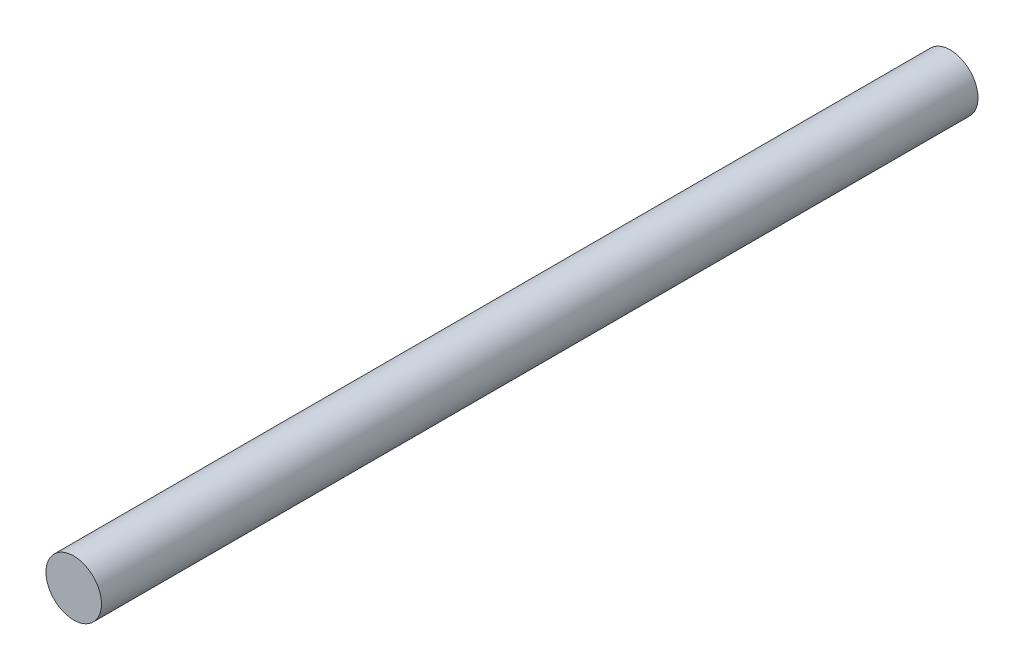
ISO-10303-21;
HEADER;
FILE_DESCRIPTION(('STEP AP214'),'2;1');
FILE_NAME('part.step','',(''),(''),'','','');
FILE_SCHEMA(('AUTOMOTIVE_DESIGN { 1 0 10303 214 1 1 1 1 }'));
ENDSEC;
DATA;
#1=APPLICATION_CONTEXT('core data for automotive mechanical design processes');
#2=APPLICATION_PROTOCOL_DEFINITION('international standard','automotive_design',2000,#1);
#3=PRODUCT_CONTEXT('',#1,'mechanical');
#4=PRODUCT('Part','Part','',(#3));
#5=PRODUCT_RELATED_PRODUCT_CATEGORY('part','',(#4));
#6=PRODUCT_DEFINITION_FORMATION('','',#4);
#7=PRODUCT_DEFINITION_CONTEXT('part definition',#1,'design');
#8=PRODUCT_DEFINITION('design','',#6,#7);
#9=PRODUCT_DEFINITION_SHAPE('','',#8);
#10=(LENGTH_UNIT() NAMED_UNIT(*) SI_UNIT(.MILLI.,.METRE.));
#11=(NAMED_UNIT(*) PLANE_ANGLE_UNIT() SI_UNIT($,.RADIAN.));
#12=(NAMED_UNIT(*) SI_UNIT($,.STERADIAN.) SOLID_ANGLE_UNIT());
#13=UNCERTAINTY_MEASURE_WITH_UNIT(LENGTH_MEASURE(1.E-05),#10,'distance_accuracy_value','');
#14=(GEOMETRIC_REPRESENTATION_CONTEXT(3) GLOBAL_UNCERTAINTY_ASSIGNED_CONTEXT((#13)) GLOBAL_UNIT_ASSIGNED_CONTEXT((#10,
#11,#12)) REPRESENTATION_CONTEXT('',''));
#15=CARTESIAN_POINT('',(0.,0.,0.));
#16=DIRECTION('',(0.,0.,1.));
#17=DIRECTION('',(1.,0.,0.));
#18=AXIS2_PLACEMENT_3D('',#15,#16,#17);
#19=CARTESIAN_POINT('',(0.,0.,120.));
#20=DIRECTION('',(0.,0.,-1.));
#21=DIRECTION('',(-1.,0.,0.));
#22=AXIS2_PLACEMENT_3D('',#19,#20,#21);
#23=CYLINDRICAL_SURFACE('',#22,3.8);
#24=CARTESIAN_POINT('',(0.,0.,120.));
#25=DIRECTION('',(0.,0.,1.));
#26=DIRECTION('',(1.,0.,0.));
#27=AXIS2_PLACEMENT_3D('',#24,#25,#26);
#28=CIRCLE('',#27,3.8);
#29=CARTESIAN_POINT('',(3.8,0.,120.));
#30=VERTEX_POINT('',#29);
#31=EDGE_CURVE('E10',#30,#30,#28,.T.);
#32=ORIENTED_EDGE('',*,*,#31,.F.);
#33=EDGE_LOOP('',(#32));
#34=FACE_BOUND('',#33,.T.);
#35=CARTESIAN_POINT('',(0.,0.,0.));
#36=DIRECTION('',(0.,0.,1.));
#37=DIRECTION('',(1.,0.,0.));
#38=AXIS2_PLACEMENT_3D('',#35,#36,#37);
#39=CIRCLE('',#38,3.8);
#40=CARTESIAN_POINT('',(3.8,0.,0.));
#41=VERTEX_POINT('',#40);
#42=EDGE_CURVE('E34',#41,#41,#39,.T.);
#43=ORIENTED_EDGE('',*,*,#42,.T.);
#44=EDGE_LOOP('',(#43));
#45=FACE_BOUND('',#44,.T.);
#46=ADVANCED_FACE('F31',(#34,#45),#23,.T.);
#47=CARTESIAN_POINT('',(0.,0.,120.));
#48=DIRECTION('',(0.,0.,1.));
#49=DIRECTION('',(1.,0.,0.));
#50=AXIS2_PLACEMENT_3D('',#47,#48,#49);
#51=PLANE('',#50);
#52=ORIENTED_EDGE('',*,*,#31,.T.);
#53=EDGE_LOOP('',(#52));
#54=FACE_BOUND('',#53,.T.);
#55=ADVANCED_FACE('F46',(#54),#51,.T.);
#56=CARTESIAN_POINT('',(0.,0.,0.));
#57=DIRECTION('',(0.,0.,1.));
#58=DIRECTION('',(1.,0.,0.));
#59=AXIS2_PLACEMENT_3D('',#56,#57,#58);
#60=PLANE('',#59);
#61=ORIENTED_EDGE('',*,*,#42,.F.);
#62=EDGE_LOOP('',(#61));
#63=FACE_BOUND('',#62,.T.);
#64=ADVANCED_FACE('F44',(#63),#60,.F.);
#65=CLOSED_SHELL('',(#46,#55,#64));
#66=MANIFOLD_SOLID_BREP('B2',#65);
#67=ADVANCED_BREP_SHAPE_REPRESENTATION('',(#18,#66),#14);
#68=SHAPE_DEFINITION_REPRESENTATION(#9,#67);
ENDSEC;
END-ISO-10303-21;
